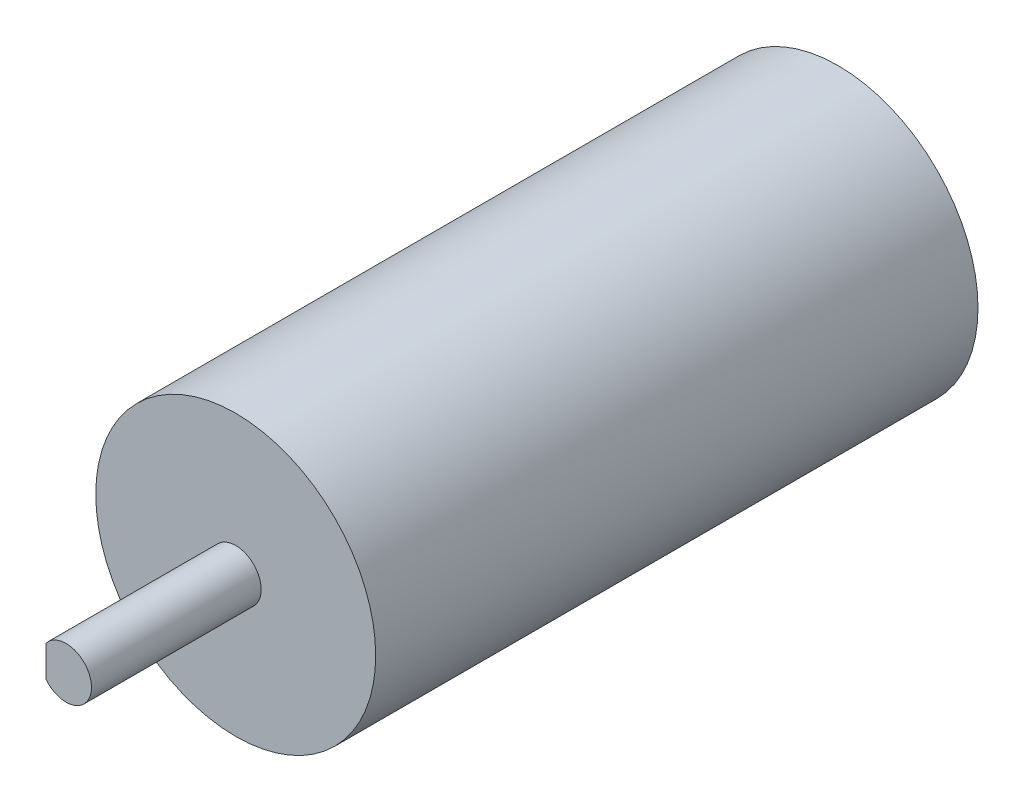
ISO-10303-21;
HEADER;
FILE_DESCRIPTION(('STEP AP214'),'2;1');
FILE_NAME('part.step','',(''),(''),'','','');
FILE_SCHEMA(('AUTOMOTIVE_DESIGN { 1 0 10303 214 1 1 1 1 }'));
ENDSEC;
DATA;
#1=APPLICATION_CONTEXT('core data for automotive mechanical design processes');
#2=APPLICATION_PROTOCOL_DEFINITION('international standard','automotive_design',2000,#1);
#3=PRODUCT_CONTEXT('',#1,'mechanical');
#4=PRODUCT('Part','Part','',(#3));
#5=PRODUCT_RELATED_PRODUCT_CATEGORY('part','',(#4));
#6=PRODUCT_DEFINITION_FORMATION('','',#4);
#7=PRODUCT_DEFINITION_CONTEXT('part definition',#1,'design');
#8=PRODUCT_DEFINITION('design','',#6,#7);
#9=PRODUCT_DEFINITION_SHAPE('','',#8);
#10=(LENGTH_UNIT() NAMED_UNIT(*) SI_UNIT(.MILLI.,.METRE.));
#11=(NAMED_UNIT(*) PLANE_ANGLE_UNIT() SI_UNIT($,.RADIAN.));
#12=(NAMED_UNIT(*) SI_UNIT($,.STERADIAN.) SOLID_ANGLE_UNIT());
#13=UNCERTAINTY_MEASURE_WITH_UNIT(LENGTH_MEASURE(1.E-05),#10,'distance_accuracy_value','');
#14=(GEOMETRIC_REPRESENTATION_CONTEXT(3) GLOBAL_UNCERTAINTY_ASSIGNED_CONTEXT((#13)) GLOBAL_UNIT_ASSIGNED_CONTEXT((#10,
#11,#12)) REPRESENTATION_CONTEXT('',''));
#15=CARTESIAN_POINT('',(0.,0.,0.));
#16=DIRECTION('',(0.,0.,1.));
#17=DIRECTION('',(1.,0.,0.));
#18=AXIS2_PLACEMENT_3D('',#15,#16,#17);
#19=CARTESIAN_POINT('',(-3.93636062533126,11.828431372549,91.));
#20=DIRECTION('',(0.,0.,-1.));
#21=DIRECTION('',(-1.,0.,0.));
#22=AXIS2_PLACEMENT_3D('',#19,#20,#21);
#23=CYLINDRICAL_SURFACE('',#22,3.);
#24=DIRECTION('',(0.,0.,-1.));
#25=VECTOR('',#24,1.);
#26=CARTESIAN_POINT('',(-6.30183738120085,13.6735654374453,91.));
#27=LINE('',#26,#25);
#28=CARTESIAN_POINT('',(-6.30183738120085,13.6735654374453,91.));
#29=VERTEX_POINT('',#28);
#30=CARTESIAN_POINT('',(-6.30183738120085,13.6735654374453,71.));
#31=VERTEX_POINT('',#30);
#32=EDGE_CURVE('E60',#29,#31,#27,.T.);
#33=ORIENTED_EDGE('',*,*,#32,.F.);
#34=CARTESIAN_POINT('',(-3.93636062533126,11.828431372549,91.));
#35=DIRECTION('',(0.,0.,1.));
#36=DIRECTION('',(1.,0.,0.));
#37=AXIS2_PLACEMENT_3D('',#34,#35,#36);
#38=CIRCLE('',#37,3.);
#39=CARTESIAN_POINT('',(-6.30183738120085,9.98329730765273,91.));
#40=VERTEX_POINT('',#39);
#41=EDGE_CURVE('E68',#40,#29,#38,.T.);
#42=ORIENTED_EDGE('',*,*,#41,.F.);
#43=DIRECTION('',(0.,0.,-1.));
#44=VECTOR('',#43,1.);
#45=CARTESIAN_POINT('',(-6.30183738120085,9.98329730765273,91.));
#46=LINE('',#45,#44);
#47=CARTESIAN_POINT('',(-6.30183738120085,9.98329730765273,71.));
#48=VERTEX_POINT('',#47);
#49=EDGE_CURVE('E50',#48,#40,#46,.F.);
#50=ORIENTED_EDGE('',*,*,#49,.F.);
#51=CARTESIAN_POINT('',(-3.93636062533126,11.828431372549,71.));
#52=DIRECTION('',(0.,0.,1.));
#53=DIRECTION('',(1.,0.,0.));
#54=AXIS2_PLACEMENT_3D('',#51,#52,#53);
#55=CIRCLE('',#54,3.);
#56=EDGE_CURVE('E43',#48,#31,#55,.T.);
#57=ORIENTED_EDGE('',*,*,#56,.T.);
#58=EDGE_LOOP('',(#33,#42,#50,#57));
#59=FACE_BOUND('',#58,.T.);
#60=ADVANCED_FACE('F35',(#59),#23,.T.);
#61=CARTESIAN_POINT('',(-3.93636062533126,11.828431372549,91.));
#62=DIRECTION('',(0.,0.,1.));
#63=DIRECTION('',(1.,0.,0.));
#64=AXIS2_PLACEMENT_3D('',#61,#62,#63);
#65=PLANE('',#64);
#66=ORIENTED_EDGE('',*,*,#41,.T.);
#67=DIRECTION('',(0.,-1.,0.));
#68=VECTOR('',#67,1.);
#69=CARTESIAN_POINT('',(-6.30183738120085,11.828431372549,91.));
#70=LINE('',#69,#68);
#71=EDGE_CURVE('E11',#29,#40,#70,.T.);
#72=ORIENTED_EDGE('',*,*,#71,.T.);
#73=EDGE_LOOP('',(#66,#72));
#74=FACE_BOUND('',#73,.T.);
#75=ADVANCED_FACE('F83',(#74),#65,.T.);
#76=CARTESIAN_POINT('',(-3.93636062533126,11.828431372549,71.));
#77=DIRECTION('',(0.,0.,-1.));
#78=DIRECTION('',(-1.,0.,0.));
#79=AXIS2_PLACEMENT_3D('',#76,#77,#78);
#80=CYLINDRICAL_SURFACE('',#79,16.5);
#81=CARTESIAN_POINT('',(-3.93636062533126,11.828431372549,71.));
#82=DIRECTION('',(0.,0.,1.));
#83=DIRECTION('',(1.,0.,0.));
#84=AXIS2_PLACEMENT_3D('',#81,#82,#83);
#85=CIRCLE('',#84,16.5);
#86=CARTESIAN_POINT('',(12.5636393746687,11.828431372549,71.));
#87=VERTEX_POINT('',#86);
#88=EDGE_CURVE('E72',#87,#87,#85,.T.);
#89=ORIENTED_EDGE('',*,*,#88,.F.);
#90=EDGE_LOOP('',(#89));
#91=FACE_BOUND('',#90,.T.);
#92=CARTESIAN_POINT('',(-3.93636062533126,11.828431372549,0.));
#93=DIRECTION('',(0.,0.,1.));
#94=DIRECTION('',(1.,0.,0.));
#95=AXIS2_PLACEMENT_3D('',#92,#93,#94);
#96=CIRCLE('',#95,16.5);
#97=CARTESIAN_POINT('',(12.5636393746687,11.828431372549,0.));
#98=VERTEX_POINT('',#97);
#99=EDGE_CURVE('E75',#98,#98,#96,.T.);
#100=ORIENTED_EDGE('',*,*,#99,.T.);
#101=EDGE_LOOP('',(#100));
#102=FACE_BOUND('',#101,.T.);
#103=ADVANCED_FACE('F37',(#91,#102),#80,.T.);
#104=CARTESIAN_POINT('',(-3.93636062533126,11.828431372549,71.));
#105=DIRECTION('',(0.,0.,1.));
#106=DIRECTION('',(1.,0.,0.));
#107=AXIS2_PLACEMENT_3D('',#104,#105,#106);
#108=PLANE('',#107);
#109=DIRECTION('',(0.,1.,0.));
#110=VECTOR('',#109,1.);
#111=CARTESIAN_POINT('',(-6.30183738120085,15.3678804536566,71.));
#112=LINE('',#111,#110);
#113=EDGE_CURVE('E58',#48,#31,#112,.T.);
#114=ORIENTED_EDGE('',*,*,#113,.T.);
#115=ORIENTED_EDGE('',*,*,#56,.F.);
#116=EDGE_LOOP('',(#114,#115));
#117=FACE_BOUND('',#116,.T.);
#118=ORIENTED_EDGE('',*,*,#88,.T.);
#119=EDGE_LOOP('',(#118));
#120=FACE_BOUND('',#119,.T.);
#121=ADVANCED_FACE('F70',(#117,#120),#108,.T.);
#122=CARTESIAN_POINT('',(-3.93636062533126,11.828431372549,0.));
#123=DIRECTION('',(0.,0.,1.));
#124=DIRECTION('',(1.,0.,0.));
#125=AXIS2_PLACEMENT_3D('',#122,#123,#124);
#126=PLANE('',#125);
#127=ORIENTED_EDGE('',*,*,#99,.F.);
#128=EDGE_LOOP('',(#127));
#129=FACE_BOUND('',#128,.T.);
#130=ADVANCED_FACE('F95',(#129),#126,.F.);
#131=CARTESIAN_POINT('',(-6.30183738120085,15.3678804536566,94.));
#132=DIRECTION('',(-1.,0.,0.));
#133=DIRECTION('',(0.,0.,1.));
#134=AXIS2_PLACEMENT_3D('',#131,#132,#133);
#135=PLANE('',#134);
#136=ORIENTED_EDGE('',*,*,#32,.T.);
#137=ORIENTED_EDGE('',*,*,#113,.F.);
#138=ORIENTED_EDGE('',*,*,#49,.T.);
#139=ORIENTED_EDGE('',*,*,#71,.F.);
#140=EDGE_LOOP('',(#136,#137,#138,#139));
#141=FACE_BOUND('',#140,.T.);
#142=ADVANCED_FACE('F59',(#141),#135,.T.);
#143=CLOSED_SHELL('',(#60,#75,#103,#121,#130,#142));
#144=MANIFOLD_SOLID_BREP('B2',#143);
#145=ADVANCED_BREP_SHAPE_REPRESENTATION('',(#18,#144),#14);
#146=SHAPE_DEFINITION_REPRESENTATION(#9,#145);
ENDSEC;
END-ISO-10303-21;
